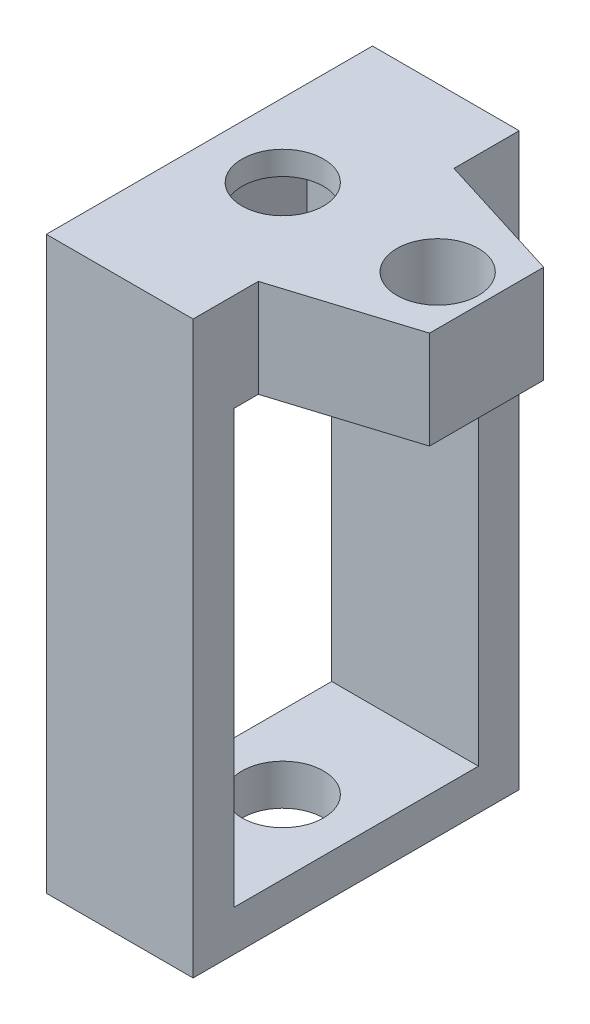
ISO-10303-21;
HEADER;
FILE_DESCRIPTION(('STEP AP214'),'2;1');
FILE_NAME('part.step','',(''),(''),'','','');
FILE_SCHEMA(('AUTOMOTIVE_DESIGN { 1 0 10303 214 1 1 1 1 }'));
ENDSEC;
DATA;
#1=APPLICATION_CONTEXT('core data for automotive mechanical design processes');
#2=APPLICATION_PROTOCOL_DEFINITION('international standard','automotive_design',2000,#1);
#3=PRODUCT_CONTEXT('',#1,'mechanical');
#4=PRODUCT('Part','Part','',(#3));
#5=PRODUCT_RELATED_PRODUCT_CATEGORY('part','',(#4));
#6=PRODUCT_DEFINITION_FORMATION('','',#4);
#7=PRODUCT_DEFINITION_CONTEXT('part definition',#1,'design');
#8=PRODUCT_DEFINITION('design','',#6,#7);
#9=PRODUCT_DEFINITION_SHAPE('','',#8);
#10=(LENGTH_UNIT() NAMED_UNIT(*) SI_UNIT(.MILLI.,.METRE.));
#11=(NAMED_UNIT(*) PLANE_ANGLE_UNIT() SI_UNIT($,.RADIAN.));
#12=(NAMED_UNIT(*) SI_UNIT($,.STERADIAN.) SOLID_ANGLE_UNIT());
#13=UNCERTAINTY_MEASURE_WITH_UNIT(LENGTH_MEASURE(1.E-05),#10,'distance_accuracy_value','');
#14=(GEOMETRIC_REPRESENTATION_CONTEXT(3) GLOBAL_UNCERTAINTY_ASSIGNED_CONTEXT((#13)) GLOBAL_UNIT_ASSIGNED_CONTEXT((#10,
#11,#12)) REPRESENTATION_CONTEXT('',''));
#15=CARTESIAN_POINT('',(0.,0.,0.));
#16=DIRECTION('',(0.,0.,1.));
#17=DIRECTION('',(1.,0.,0.));
#18=AXIS2_PLACEMENT_3D('',#15,#16,#17);
#19=CARTESIAN_POINT('',(0.,-82.,0.));
#20=DIRECTION('',(0.,1.,0.));
#21=DIRECTION('',(0.,0.,1.));
#22=AXIS2_PLACEMENT_3D('',#19,#20,#21);
#23=CYLINDRICAL_SURFACE('',#22,2.5);
#24=CARTESIAN_POINT('',(0.,-53.,0.));
#25=DIRECTION('',(0.,-1.,0.));
#26=DIRECTION('',(0.,0.,-1.));
#27=AXIS2_PLACEMENT_3D('',#24,#25,#26);
#28=CIRCLE('',#27,2.5);
#29=CARTESIAN_POINT('',(0.,-53.,-2.5));
#30=VERTEX_POINT('',#29);
#31=EDGE_CURVE('E161',#30,#30,#28,.T.);
#32=ORIENTED_EDGE('',*,*,#31,.T.);
#33=EDGE_LOOP('',(#32));
#34=FACE_BOUND('',#33,.T.);
#35=CARTESIAN_POINT('',(0.,-51.55,0.));
#36=DIRECTION('',(0.,1.,0.));
#37=DIRECTION('',(0.,0.,1.));
#38=AXIS2_PLACEMENT_3D('',#35,#36,#37);
#39=CIRCLE('',#38,2.5);
#40=CARTESIAN_POINT('',(0.,-51.55,2.5));
#41=VERTEX_POINT('',#40);
#42=EDGE_CURVE('E43',#41,#41,#39,.F.);
#43=ORIENTED_EDGE('',*,*,#42,.F.);
#44=EDGE_LOOP('',(#43));
#45=FACE_BOUND('',#44,.T.);
#46=ADVANCED_FACE('F39',(#34,#45),#23,.F.);
#47=CARTESIAN_POINT('',(-4.5,-47.,-10.));
#48=DIRECTION('',(0.,0.,1.));
#49=DIRECTION('',(1.,0.,0.));
#50=AXIS2_PLACEMENT_3D('',#47,#48,#49);
#51=PLANE('',#50);
#52=DIRECTION('',(0.,-1.,0.));
#53=VECTOR('',#52,1.);
#54=CARTESIAN_POINT('',(4.5,-47.,-10.));
#55=LINE('',#54,#53);
#56=CARTESIAN_POINT('',(4.5,-47.,-10.));
#57=VERTEX_POINT('',#56);
#58=CARTESIAN_POINT('',(4.50000000000003,-82.,-10.));
#59=VERTEX_POINT('',#58);
#60=EDGE_CURVE('E130',#57,#59,#55,.T.);
#61=ORIENTED_EDGE('',*,*,#60,.T.);
#62=DIRECTION('',(-1.,0.,0.));
#63=VECTOR('',#62,1.);
#64=CARTESIAN_POINT('',(39.7278299076171,-82.,-10.));
#65=LINE('',#64,#63);
#66=CARTESIAN_POINT('',(-4.5,-82.,-10.));
#67=VERTEX_POINT('',#66);
#68=EDGE_CURVE('E214',#59,#67,#65,.T.);
#69=ORIENTED_EDGE('',*,*,#68,.T.);
#70=DIRECTION('',(0.,-1.,0.));
#71=VECTOR('',#70,1.);
#72=CARTESIAN_POINT('',(-4.5,-47.,-10.));
#73=LINE('',#72,#71);
#74=CARTESIAN_POINT('',(-4.5,-47.,-10.));
#75=VERTEX_POINT('',#74);
#76=EDGE_CURVE('E11',#75,#67,#73,.T.);
#77=ORIENTED_EDGE('',*,*,#76,.F.);
#78=DIRECTION('',(-1.,0.,0.));
#79=VECTOR('',#78,1.);
#80=CARTESIAN_POINT('',(-4.5,-47.,-10.));
#81=LINE('',#80,#79);
#82=EDGE_CURVE('E146',#57,#75,#81,.T.);
#83=ORIENTED_EDGE('',*,*,#82,.F.);
#84=EDGE_LOOP('',(#61,#69,#77,#83));
#85=FACE_BOUND('',#84,.T.);
#86=ADVANCED_FACE('F41',(#85),#51,.F.);
#87=CARTESIAN_POINT('',(-4.5,-47.,-10.));
#88=DIRECTION('',(1.,0.,0.));
#89=DIRECTION('',(0.,0.,-1.));
#90=AXIS2_PLACEMENT_3D('',#87,#88,#89);
#91=PLANE('',#90);
#92=DIRECTION('',(0.,-1.,0.));
#93=VECTOR('',#92,1.);
#94=CARTESIAN_POINT('',(-4.5,-82.,-7.5));
#95=LINE('',#94,#93);
#96=CARTESIAN_POINT('',(-4.5,-53.,-7.5));
#97=VERTEX_POINT('',#96);
#98=CARTESIAN_POINT('',(-4.5,-79.5,-7.5));
#99=VERTEX_POINT('',#98);
#100=EDGE_CURVE('E56',#97,#99,#95,.T.);
#101=ORIENTED_EDGE('',*,*,#100,.F.);
#102=DIRECTION('',(0.,0.,1.));
#103=VECTOR('',#102,1.);
#104=CARTESIAN_POINT('',(-4.5,-53.,-10.));
#105=LINE('',#104,#103);
#106=CARTESIAN_POINT('',(-4.5,-53.,7.5));
#107=VERTEX_POINT('',#106);
#108=EDGE_CURVE('E134',#97,#107,#105,.T.);
#109=ORIENTED_EDGE('',*,*,#108,.T.);
#110=DIRECTION('',(0.,1.,0.));
#111=VECTOR('',#110,1.);
#112=CARTESIAN_POINT('',(-4.5,-53.,7.5));
#113=LINE('',#112,#111);
#114=CARTESIAN_POINT('',(-4.5,-79.5,7.49999999999999));
#115=VERTEX_POINT('',#114);
#116=EDGE_CURVE('E208',#115,#107,#113,.T.);
#117=ORIENTED_EDGE('',*,*,#116,.F.);
#118=DIRECTION('',(0.,0.,1.));
#119=VECTOR('',#118,1.);
#120=CARTESIAN_POINT('',(-4.5,-79.5,9.99999999999999));
#121=LINE('',#120,#119);
#122=EDGE_CURVE('E205',#99,#115,#121,.T.);
#123=ORIENTED_EDGE('',*,*,#122,.F.);
#124=EDGE_LOOP('',(#101,#109,#117,#123));
#125=FACE_BOUND('',#124,.T.);
#126=ORIENTED_EDGE('',*,*,#76,.T.);
#127=DIRECTION('',(0.,0.,1.));
#128=VECTOR('',#127,1.);
#129=CARTESIAN_POINT('',(-4.5,-82.,9.99999999999999));
#130=LINE('',#129,#128);
#131=CARTESIAN_POINT('',(-4.5,-82.,9.99999999999999));
#132=VERTEX_POINT('',#131);
#133=EDGE_CURVE('E211',#67,#132,#130,.T.);
#134=ORIENTED_EDGE('',*,*,#133,.T.);
#135=DIRECTION('',(0.,-1.,0.));
#136=VECTOR('',#135,1.);
#137=CARTESIAN_POINT('',(-4.5,-47.,10.));
#138=LINE('',#137,#136);
#139=CARTESIAN_POINT('',(-4.5,-47.,10.));
#140=VERTEX_POINT('',#139);
#141=EDGE_CURVE('E48',#140,#132,#138,.T.);
#142=ORIENTED_EDGE('',*,*,#141,.F.);
#143=DIRECTION('',(0.,0.,1.));
#144=VECTOR('',#143,1.);
#145=CARTESIAN_POINT('',(-4.5,-47.,-10.));
#146=LINE('',#145,#144);
#147=EDGE_CURVE('E95',#75,#140,#146,.T.);
#148=ORIENTED_EDGE('',*,*,#147,.F.);
#149=EDGE_LOOP('',(#126,#134,#142,#148));
#150=FACE_BOUND('',#149,.T.);
#151=ADVANCED_FACE('F391',(#125,#150),#91,.F.);
#152=CARTESIAN_POINT('',(-4.5,-47.,10.));
#153=DIRECTION('',(0.,0.,-1.));
#154=DIRECTION('',(-1.,0.,0.));
#155=AXIS2_PLACEMENT_3D('',#152,#153,#154);
#156=PLANE('',#155);
#157=ORIENTED_EDGE('',*,*,#141,.T.);
#158=DIRECTION('',(-1.,0.,0.));
#159=VECTOR('',#158,1.);
#160=CARTESIAN_POINT('',(39.7278299076171,-82.,9.99999999999999));
#161=LINE('',#160,#159);
#162=CARTESIAN_POINT('',(4.50000000000001,-82.,9.99999999999999));
#163=VERTEX_POINT('',#162);
#164=EDGE_CURVE('E228',#163,#132,#161,.T.);
#165=ORIENTED_EDGE('',*,*,#164,.F.);
#166=DIRECTION('',(0.,-1.,0.));
#167=VECTOR('',#166,1.);
#168=CARTESIAN_POINT('',(4.5,-47.,10.));
#169=LINE('',#168,#167);
#170=CARTESIAN_POINT('',(4.5,-47.,10.));
#171=VERTEX_POINT('',#170);
#172=EDGE_CURVE('E154',#171,#163,#169,.T.);
#173=ORIENTED_EDGE('',*,*,#172,.F.);
#174=DIRECTION('',(1.,0.,0.));
#175=VECTOR('',#174,1.);
#176=CARTESIAN_POINT('',(-4.5,-47.,10.));
#177=LINE('',#176,#175);
#178=EDGE_CURVE('E250',#140,#171,#177,.T.);
#179=ORIENTED_EDGE('',*,*,#178,.F.);
#180=EDGE_LOOP('',(#157,#165,#173,#179));
#181=FACE_BOUND('',#180,.T.);
#182=ADVANCED_FACE('F419',(#181),#156,.F.);
#183=CARTESIAN_POINT('',(4.50000000000001,-47.,6.));
#184=DIRECTION('',(-0.298274993135947,0.,-0.95447997803503));
#185=DIRECTION('',(-0.95447997803503,0.,0.298274993135947));
#186=AXIS2_PLACEMENT_3D('',#183,#184,#185);
#187=PLANE('',#186);
#188=DIRECTION('',(0.95447997803503,0.,-0.298274993135947));
#189=VECTOR('',#188,1.);
#190=CARTESIAN_POINT('',(4.50000000000001,-53.,6.));
#191=LINE('',#190,#189);
#192=CARTESIAN_POINT('',(4.50000000000001,-53.,6.));
#193=VERTEX_POINT('',#192);
#194=CARTESIAN_POINT('',(12.5,-53.,3.5));
#195=VERTEX_POINT('',#194);
#196=EDGE_CURVE('E139',#193,#195,#191,.T.);
#197=ORIENTED_EDGE('',*,*,#196,.T.);
#198=DIRECTION('',(0.,-1.,0.));
#199=VECTOR('',#198,1.);
#200=CARTESIAN_POINT('',(12.5,-47.,3.5));
#201=LINE('',#200,#199);
#202=CARTESIAN_POINT('',(12.5,-47.,3.5));
#203=VERTEX_POINT('',#202);
#204=EDGE_CURVE('E125',#203,#195,#201,.T.);
#205=ORIENTED_EDGE('',*,*,#204,.F.);
#206=DIRECTION('',(0.95447997803503,0.,-0.298274993135947));
#207=VECTOR('',#206,1.);
#208=CARTESIAN_POINT('',(4.50000000000001,-47.,6.));
#209=LINE('',#208,#207);
#210=CARTESIAN_POINT('',(4.50000000000001,-47.,6.));
#211=VERTEX_POINT('',#210);
#212=EDGE_CURVE('E116',#211,#203,#209,.T.);
#213=ORIENTED_EDGE('',*,*,#212,.F.);
#214=DIRECTION('',(0.,-1.,0.));
#215=VECTOR('',#214,1.);
#216=CARTESIAN_POINT('',(4.50000000000001,-47.,6.));
#217=LINE('',#216,#215);
#218=EDGE_CURVE('E151',#211,#193,#217,.T.);
#219=ORIENTED_EDGE('',*,*,#218,.T.);
#220=EDGE_LOOP('',(#197,#205,#213,#219));
#221=FACE_BOUND('',#220,.T.);
#222=ADVANCED_FACE('F262',(#221),#187,.F.);
#223=CARTESIAN_POINT('',(12.5,-47.,3.5));
#224=DIRECTION('',(-1.,0.,0.));
#225=DIRECTION('',(0.,0.,1.));
#226=AXIS2_PLACEMENT_3D('',#223,#224,#225);
#227=PLANE('',#226);
#228=DIRECTION('',(0.,0.,-1.));
#229=VECTOR('',#228,1.);
#230=CARTESIAN_POINT('',(12.5,-53.,3.5));
#231=LINE('',#230,#229);
#232=CARTESIAN_POINT('',(12.5,-53.,-3.5));
#233=VERTEX_POINT('',#232);
#234=EDGE_CURVE('E124',#195,#233,#231,.T.);
#235=ORIENTED_EDGE('',*,*,#234,.T.);
#236=DIRECTION('',(0.,-1.,0.));
#237=VECTOR('',#236,1.);
#238=CARTESIAN_POINT('',(12.5,-47.,-3.5));
#239=LINE('',#238,#237);
#240=CARTESIAN_POINT('',(12.5,-47.,-3.5));
#241=VERTEX_POINT('',#240);
#242=EDGE_CURVE('E121',#241,#233,#239,.T.);
#243=ORIENTED_EDGE('',*,*,#242,.F.);
#244=DIRECTION('',(0.,0.,-1.));
#245=VECTOR('',#244,1.);
#246=CARTESIAN_POINT('',(12.5,-47.,3.5));
#247=LINE('',#246,#245);
#248=EDGE_CURVE('E110',#203,#241,#247,.T.);
#249=ORIENTED_EDGE('',*,*,#248,.F.);
#250=ORIENTED_EDGE('',*,*,#204,.T.);
#251=EDGE_LOOP('',(#235,#243,#249,#250));
#252=FACE_BOUND('',#251,.T.);
#253=ADVANCED_FACE('F122',(#252),#227,.F.);
#254=CARTESIAN_POINT('',(12.5,-47.,-3.5));
#255=DIRECTION('',(-0.298274993135947,0.,0.95447997803503));
#256=DIRECTION('',(0.95447997803503,0.,0.298274993135947));
#257=AXIS2_PLACEMENT_3D('',#254,#255,#256);
#258=PLANE('',#257);
#259=DIRECTION('',(-0.95447997803503,0.,-0.298274993135947));
#260=VECTOR('',#259,1.);
#261=CARTESIAN_POINT('',(12.5,-53.,-3.5));
#262=LINE('',#261,#260);
#263=CARTESIAN_POINT('',(4.50000000000001,-53.,-6.));
#264=VERTEX_POINT('',#263);
#265=EDGE_CURVE('E87',#233,#264,#262,.T.);
#266=ORIENTED_EDGE('',*,*,#265,.T.);
#267=DIRECTION('',(0.,-1.,0.));
#268=VECTOR('',#267,1.);
#269=CARTESIAN_POINT('',(4.50000000000001,-47.,-6.));
#270=LINE('',#269,#268);
#271=CARTESIAN_POINT('',(4.50000000000001,-47.,-6.));
#272=VERTEX_POINT('',#271);
#273=EDGE_CURVE('E126',#272,#264,#270,.T.);
#274=ORIENTED_EDGE('',*,*,#273,.F.);
#275=DIRECTION('',(-0.95447997803503,0.,-0.298274993135947));
#276=VECTOR('',#275,1.);
#277=CARTESIAN_POINT('',(12.5,-47.,-3.5));
#278=LINE('',#277,#276);
#279=EDGE_CURVE('E114',#241,#272,#278,.T.);
#280=ORIENTED_EDGE('',*,*,#279,.F.);
#281=ORIENTED_EDGE('',*,*,#242,.T.);
#282=EDGE_LOOP('',(#266,#274,#280,#281));
#283=FACE_BOUND('',#282,.T.);
#284=ADVANCED_FACE('F128',(#283),#258,.F.);
#285=CARTESIAN_POINT('',(4.5,-47.,-10.));
#286=DIRECTION('',(-1.,0.,0.));
#287=DIRECTION('',(0.,0.,1.));
#288=AXIS2_PLACEMENT_3D('',#285,#286,#287);
#289=PLANE('',#288);
#290=DIRECTION('',(0.,0.,-1.));
#291=VECTOR('',#290,1.);
#292=CARTESIAN_POINT('',(4.5,-53.,-10.));
#293=LINE('',#292,#291);
#294=CARTESIAN_POINT('',(4.50000000000002,-53.,-7.5));
#295=VERTEX_POINT('',#294);
#296=EDGE_CURVE('E143',#264,#295,#293,.T.);
#297=ORIENTED_EDGE('',*,*,#296,.T.);
#298=DIRECTION('',(0.,-1.,0.));
#299=VECTOR('',#298,1.);
#300=CARTESIAN_POINT('',(4.50000000000002,-82.,-7.5));
#301=LINE('',#300,#299);
#302=CARTESIAN_POINT('',(4.50000000000002,-79.5,-7.5));
#303=VERTEX_POINT('',#302);
#304=EDGE_CURVE('E222',#295,#303,#301,.T.);
#305=ORIENTED_EDGE('',*,*,#304,.T.);
#306=DIRECTION('',(0.,0.,1.));
#307=VECTOR('',#306,1.);
#308=CARTESIAN_POINT('',(4.5,-79.5,9.99999999999996));
#309=LINE('',#308,#307);
#310=CARTESIAN_POINT('',(4.5,-79.5,7.49999999999999));
#311=VERTEX_POINT('',#310);
#312=EDGE_CURVE('E218',#303,#311,#309,.T.);
#313=ORIENTED_EDGE('',*,*,#312,.T.);
#314=DIRECTION('',(0.,1.,0.));
#315=VECTOR('',#314,1.);
#316=CARTESIAN_POINT('',(4.5,-53.,7.5));
#317=LINE('',#316,#315);
#318=CARTESIAN_POINT('',(4.50000000000001,-53.,7.5));
#319=VERTEX_POINT('',#318);
#320=EDGE_CURVE('E215',#311,#319,#317,.T.);
#321=ORIENTED_EDGE('',*,*,#320,.T.);
#322=DIRECTION('',(0.,0.,-1.));
#323=VECTOR('',#322,1.);
#324=CARTESIAN_POINT('',(4.5,-53.,10.));
#325=LINE('',#324,#323);
#326=EDGE_CURVE('E136',#319,#193,#325,.T.);
#327=ORIENTED_EDGE('',*,*,#326,.T.);
#328=ORIENTED_EDGE('',*,*,#218,.F.);
#329=DIRECTION('',(0.,0.,-1.));
#330=VECTOR('',#329,1.);
#331=CARTESIAN_POINT('',(4.5,-47.,10.));
#332=LINE('',#331,#330);
#333=EDGE_CURVE('E252',#171,#211,#332,.T.);
#334=ORIENTED_EDGE('',*,*,#333,.F.);
#335=ORIENTED_EDGE('',*,*,#172,.T.);
#336=DIRECTION('',(0.,0.,1.));
#337=VECTOR('',#336,1.);
#338=CARTESIAN_POINT('',(4.5,-82.,9.99999999999996));
#339=LINE('',#338,#337);
#340=EDGE_CURVE('E219',#59,#163,#339,.T.);
#341=ORIENTED_EDGE('',*,*,#340,.F.);
#342=ORIENTED_EDGE('',*,*,#60,.F.);
#343=DIRECTION('',(0.,0.,-1.));
#344=VECTOR('',#343,1.);
#345=CARTESIAN_POINT('',(4.5,-47.,-10.));
#346=LINE('',#345,#344);
#347=EDGE_CURVE('E65',#272,#57,#346,.T.);
#348=ORIENTED_EDGE('',*,*,#347,.F.);
#349=ORIENTED_EDGE('',*,*,#273,.T.);
#350=EDGE_LOOP('',(#297,#305,#313,#321,#327,#328,#334,#335,#341,#342,#348,#349));
#351=FACE_BOUND('',#350,.T.);
#352=ADVANCED_FACE('F258',(#351),#289,.F.);
#353=CARTESIAN_POINT('',(0.,-47.,0.));
#354=DIRECTION('',(0.,-1.,0.));
#355=DIRECTION('',(0.,0.,-1.));
#356=AXIS2_PLACEMENT_3D('',#353,#354,#355);
#357=PLANE('',#356);
#358=CARTESIAN_POINT('',(0.,-47.,0.));
#359=DIRECTION('',(0.,1.,0.));
#360=DIRECTION('',(0.,0.,1.));
#361=AXIS2_PLACEMENT_3D('',#358,#359,#360);
#362=CIRCLE('',#361,2.5);
#363=CARTESIAN_POINT('',(0.,-47.,2.5));
#364=VERTEX_POINT('',#363);
#365=EDGE_CURVE('E169',#364,#364,#362,.T.);
#366=ORIENTED_EDGE('',*,*,#365,.F.);
#367=EDGE_LOOP('',(#366));
#368=FACE_BOUND('',#367,.T.);
#369=CARTESIAN_POINT('',(9.5,-47.,0.));
#370=DIRECTION('',(0.,1.,0.));
#371=DIRECTION('',(0.,0.,1.));
#372=AXIS2_PLACEMENT_3D('',#369,#370,#371);
#373=CIRCLE('',#372,2.5);
#374=CARTESIAN_POINT('',(9.5,-47.,2.5));
#375=VERTEX_POINT('',#374);
#376=EDGE_CURVE('E225',#375,#375,#373,.T.);
#377=ORIENTED_EDGE('',*,*,#376,.F.);
#378=EDGE_LOOP('',(#377));
#379=FACE_BOUND('',#378,.T.);
#380=ORIENTED_EDGE('',*,*,#82,.T.);
#381=ORIENTED_EDGE('',*,*,#147,.T.);
#382=ORIENTED_EDGE('',*,*,#178,.T.);
#383=ORIENTED_EDGE('',*,*,#333,.T.);
#384=ORIENTED_EDGE('',*,*,#212,.T.);
#385=ORIENTED_EDGE('',*,*,#248,.T.);
#386=ORIENTED_EDGE('',*,*,#279,.T.);
#387=ORIENTED_EDGE('',*,*,#347,.T.);
#388=EDGE_LOOP('',(#380,#381,#382,#383,#384,#385,#386,#387));
#389=FACE_BOUND('',#388,.T.);
#390=ADVANCED_FACE('F112',(#368,#379,#389),#357,.F.);
#391=CARTESIAN_POINT('',(0.,-53.,0.));
#392=DIRECTION('',(0.,-1.,0.));
#393=DIRECTION('',(0.,0.,-1.));
#394=AXIS2_PLACEMENT_3D('',#391,#392,#393);
#395=PLANE('',#394);
#396=ORIENTED_EDGE('',*,*,#31,.F.);
#397=EDGE_LOOP('',(#396));
#398=FACE_BOUND('',#397,.T.);
#399=DIRECTION('',(-1.,0.,0.));
#400=VECTOR('',#399,1.);
#401=CARTESIAN_POINT('',(39.7278299076171,-53.,7.5));
#402=LINE('',#401,#400);
#403=EDGE_CURVE('E231',#319,#107,#402,.T.);
#404=ORIENTED_EDGE('',*,*,#403,.T.);
#405=ORIENTED_EDGE('',*,*,#108,.F.);
#406=DIRECTION('',(-1.,0.,0.));
#407=VECTOR('',#406,1.);
#408=CARTESIAN_POINT('',(39.7278299076171,-53.,-7.5));
#409=LINE('',#408,#407);
#410=EDGE_CURVE('E240',#295,#97,#409,.T.);
#411=ORIENTED_EDGE('',*,*,#410,.F.);
#412=ORIENTED_EDGE('',*,*,#296,.F.);
#413=ORIENTED_EDGE('',*,*,#265,.F.);
#414=ORIENTED_EDGE('',*,*,#234,.F.);
#415=ORIENTED_EDGE('',*,*,#196,.F.);
#416=ORIENTED_EDGE('',*,*,#326,.F.);
#417=EDGE_LOOP('',(#404,#405,#411,#412,#413,#414,#415,#416));
#418=FACE_BOUND('',#417,.T.);
#419=CARTESIAN_POINT('',(9.5,-53.,0.));
#420=DIRECTION('',(0.,1.,0.));
#421=DIRECTION('',(0.,0.,1.));
#422=AXIS2_PLACEMENT_3D('',#419,#420,#421);
#423=CIRCLE('',#422,2.5);
#424=CARTESIAN_POINT('',(9.5,-53.,2.5));
#425=VERTEX_POINT('',#424);
#426=EDGE_CURVE('E137',#425,#425,#423,.T.);
#427=ORIENTED_EDGE('',*,*,#426,.T.);
#428=EDGE_LOOP('',(#427));
#429=FACE_BOUND('',#428,.T.);
#430=ADVANCED_FACE('F264',(#398,#418,#429),#395,.T.);
#431=CARTESIAN_POINT('',(9.5,-53.,0.));
#432=DIRECTION('',(0.,1.,0.));
#433=DIRECTION('',(0.,0.,1.));
#434=AXIS2_PLACEMENT_3D('',#431,#432,#433);
#435=CYLINDRICAL_SURFACE('',#434,2.5);
#436=ORIENTED_EDGE('',*,*,#426,.F.);
#437=EDGE_LOOP('',(#436));
#438=FACE_BOUND('',#437,.T.);
#439=ORIENTED_EDGE('',*,*,#376,.T.);
#440=EDGE_LOOP('',(#439));
#441=FACE_BOUND('',#440,.T.);
#442=ADVANCED_FACE('F411',(#438,#441),#435,.F.);
#443=CARTESIAN_POINT('',(39.7278299076171,-82.,9.99999999999999));
#444=DIRECTION('',(0.,1.,0.));
#445=DIRECTION('',(0.,0.,1.));
#446=AXIS2_PLACEMENT_3D('',#443,#444,#445);
#447=PLANE('',#446);
#448=CARTESIAN_POINT('',(0.,-82.,0.));
#449=DIRECTION('',(0.,1.,0.));
#450=DIRECTION('',(0.,0.,1.));
#451=AXIS2_PLACEMENT_3D('',#448,#449,#450);
#452=CIRCLE('',#451,2.5);
#453=CARTESIAN_POINT('',(0.,-82.,2.5));
#454=VERTEX_POINT('',#453);
#455=EDGE_CURVE('E162',#454,#454,#452,.T.);
#456=ORIENTED_EDGE('',*,*,#455,.T.);
#457=EDGE_LOOP('',(#456));
#458=FACE_BOUND('',#457,.T.);
#459=ORIENTED_EDGE('',*,*,#68,.F.);
#460=ORIENTED_EDGE('',*,*,#340,.T.);
#461=ORIENTED_EDGE('',*,*,#164,.T.);
#462=ORIENTED_EDGE('',*,*,#133,.F.);
#463=EDGE_LOOP('',(#459,#460,#461,#462));
#464=FACE_BOUND('',#463,.T.);
#465=ADVANCED_FACE('F407',(#458,#464),#447,.F.);
#466=CARTESIAN_POINT('',(39.7278299076171,-53.,7.5));
#467=DIRECTION('',(0.,0.,-1.));
#468=DIRECTION('',(0.,1.,0.));
#469=AXIS2_PLACEMENT_3D('',#466,#467,#468);
#470=PLANE('',#469);
#471=ORIENTED_EDGE('',*,*,#320,.F.);
#472=DIRECTION('',(-1.,0.,0.));
#473=VECTOR('',#472,1.);
#474=CARTESIAN_POINT('',(39.7278299076171,-79.5,7.49999999999999));
#475=LINE('',#474,#473);
#476=EDGE_CURVE('E234',#311,#115,#475,.T.);
#477=ORIENTED_EDGE('',*,*,#476,.T.);
#478=ORIENTED_EDGE('',*,*,#116,.T.);
#479=ORIENTED_EDGE('',*,*,#403,.F.);
#480=EDGE_LOOP('',(#471,#477,#478,#479));
#481=FACE_BOUND('',#480,.T.);
#482=ADVANCED_FACE('F410',(#481),#470,.T.);
#483=CARTESIAN_POINT('',(39.7278299076171,-79.5,9.99999999999999));
#484=DIRECTION('',(0.,1.,0.));
#485=DIRECTION('',(0.,0.,1.));
#486=AXIS2_PLACEMENT_3D('',#483,#484,#485);
#487=PLANE('',#486);
#488=CARTESIAN_POINT('',(0.,-79.5,0.));
#489=DIRECTION('',(0.,1.,0.));
#490=DIRECTION('',(0.,0.,1.));
#491=AXIS2_PLACEMENT_3D('',#488,#489,#490);
#492=CIRCLE('',#491,2.5);
#493=CARTESIAN_POINT('',(0.,-79.5,2.5));
#494=VERTEX_POINT('',#493);
#495=EDGE_CURVE('E159',#494,#494,#492,.T.);
#496=ORIENTED_EDGE('',*,*,#495,.F.);
#497=EDGE_LOOP('',(#496));
#498=FACE_BOUND('',#497,.T.);
#499=ORIENTED_EDGE('',*,*,#312,.F.);
#500=DIRECTION('',(-1.,0.,0.));
#501=VECTOR('',#500,1.);
#502=CARTESIAN_POINT('',(39.7278299076171,-79.5,-7.5));
#503=LINE('',#502,#501);
#504=EDGE_CURVE('E237',#303,#99,#503,.T.);
#505=ORIENTED_EDGE('',*,*,#504,.T.);
#506=ORIENTED_EDGE('',*,*,#122,.T.);
#507=ORIENTED_EDGE('',*,*,#476,.F.);
#508=EDGE_LOOP('',(#499,#505,#506,#507));
#509=FACE_BOUND('',#508,.T.);
#510=ADVANCED_FACE('F401',(#498,#509),#487,.T.);
#511=CARTESIAN_POINT('',(39.7278299076171,-82.,-7.5));
#512=DIRECTION('',(0.,0.,1.));
#513=DIRECTION('',(1.,0.,0.));
#514=AXIS2_PLACEMENT_3D('',#511,#512,#513);
#515=PLANE('',#514);
#516=ORIENTED_EDGE('',*,*,#304,.F.);
#517=ORIENTED_EDGE('',*,*,#410,.T.);
#518=ORIENTED_EDGE('',*,*,#100,.T.);
#519=ORIENTED_EDGE('',*,*,#504,.F.);
#520=EDGE_LOOP('',(#516,#517,#518,#519));
#521=FACE_BOUND('',#520,.T.);
#522=ADVANCED_FACE('F395',(#521),#515,.T.);
#523=ORIENTED_EDGE('',*,*,#495,.T.);
#524=EDGE_LOOP('',(#523));
#525=FACE_BOUND('',#524,.T.);
#526=ORIENTED_EDGE('',*,*,#455,.F.);
#527=EDGE_LOOP('',(#526));
#528=FACE_BOUND('',#527,.T.);
#529=ADVANCED_FACE('F385',(#525,#528),#23,.F.);
#530=CARTESIAN_POINT('',(0.,-48.45,0.));
#531=DIRECTION('',(0.,1.,0.));
#532=DIRECTION('',(0.,0.,1.));
#533=AXIS2_PLACEMENT_3D('',#530,#531,#532);
#534=CIRCLE('',#533,2.5);
#535=CARTESIAN_POINT('',(0.,-48.45,2.5));
#536=VERTEX_POINT('',#535);
#537=EDGE_CURVE('E163',#536,#536,#534,.F.);
#538=ORIENTED_EDGE('',*,*,#537,.T.);
#539=EDGE_LOOP('',(#538));
#540=FACE_BOUND('',#539,.T.);
#541=ORIENTED_EDGE('',*,*,#365,.T.);
#542=EDGE_LOOP('',(#541));
#543=FACE_BOUND('',#542,.T.);
#544=ADVANCED_FACE('F384',(#540,#543),#23,.F.);
#545=CARTESIAN_POINT('',(0.,-51.55,0.));
#546=DIRECTION('',(0.,1.,0.));
#547=DIRECTION('',(0.,0.,1.));
#548=AXIS2_PLACEMENT_3D('',#545,#546,#547);
#549=PLANE('',#548);
#550=DIRECTION('',(1.,0.,0.));
#551=VECTOR('',#550,1.);
#552=CARTESIAN_POINT('',(-2.02072594216369,-51.55,3.5));
#553=LINE('',#552,#551);
#554=CARTESIAN_POINT('',(-2.02072594216369,-51.55,3.5));
#555=VERTEX_POINT('',#554);
#556=CARTESIAN_POINT('',(2.02072594216369,-51.55,3.5));
#557=VERTEX_POINT('',#556);
#558=EDGE_CURVE('E322',#555,#557,#553,.T.);
#559=ORIENTED_EDGE('',*,*,#558,.T.);
#560=DIRECTION('',(0.5,0.,-0.866025403784439));
#561=VECTOR('',#560,1.);
#562=CARTESIAN_POINT('',(2.02072594216369,-51.55,3.5));
#563=LINE('',#562,#561);
#564=CARTESIAN_POINT('',(4.04145188432738,-51.55,0.));
#565=VERTEX_POINT('',#564);
#566=EDGE_CURVE('E329',#557,#565,#563,.T.);
#567=ORIENTED_EDGE('',*,*,#566,.T.);
#568=DIRECTION('',(-0.5,0.,-0.866025403784439));
#569=VECTOR('',#568,1.);
#570=CARTESIAN_POINT('',(4.04145188432738,-51.55,0.));
#571=LINE('',#570,#569);
#572=CARTESIAN_POINT('',(2.02072594216369,-51.55,-3.5));
#573=VERTEX_POINT('',#572);
#574=EDGE_CURVE('E334',#565,#573,#571,.T.);
#575=ORIENTED_EDGE('',*,*,#574,.T.);
#576=DIRECTION('',(-1.,0.,0.));
#577=VECTOR('',#576,1.);
#578=CARTESIAN_POINT('',(2.02072594216369,-51.55,-3.5));
#579=LINE('',#578,#577);
#580=CARTESIAN_POINT('',(-2.02072594216369,-51.55,-3.5));
#581=VERTEX_POINT('',#580);
#582=EDGE_CURVE('E345',#573,#581,#579,.T.);
#583=ORIENTED_EDGE('',*,*,#582,.T.);
#584=DIRECTION('',(-0.5,0.,0.866025403784439));
#585=VECTOR('',#584,1.);
#586=CARTESIAN_POINT('',(-2.02072594216369,-51.55,-3.5));
#587=LINE('',#586,#585);
#588=CARTESIAN_POINT('',(-4.04145188432738,-51.55,0.));
#589=VERTEX_POINT('',#588);
#590=EDGE_CURVE('E348',#581,#589,#587,.T.);
#591=ORIENTED_EDGE('',*,*,#590,.T.);
#592=DIRECTION('',(0.5,0.,0.866025403784439));
#593=VECTOR('',#592,1.);
#594=CARTESIAN_POINT('',(-4.04145188432738,-51.55,0.));
#595=LINE('',#594,#593);
#596=EDGE_CURVE('E197',#589,#555,#595,.T.);
#597=ORIENTED_EDGE('',*,*,#596,.T.);
#598=EDGE_LOOP('',(#559,#567,#575,#583,#591,#597));
#599=FACE_BOUND('',#598,.T.);
#600=ORIENTED_EDGE('',*,*,#42,.T.);
#601=EDGE_LOOP('',(#600));
#602=FACE_BOUND('',#601,.T.);
#603=ADVANCED_FACE('F336',(#599,#602),#549,.T.);
#604=CARTESIAN_POINT('',(0.,-48.45,0.));
#605=DIRECTION('',(0.,1.,0.));
#606=DIRECTION('',(0.,0.,1.));
#607=AXIS2_PLACEMENT_3D('',#604,#605,#606);
#608=PLANE('',#607);
#609=DIRECTION('',(1.,0.,0.));
#610=VECTOR('',#609,1.);
#611=CARTESIAN_POINT('',(-2.02072594216369,-48.45,3.5));
#612=LINE('',#611,#610);
#613=CARTESIAN_POINT('',(-2.02072594216369,-48.45,3.5));
#614=VERTEX_POINT('',#613);
#615=CARTESIAN_POINT('',(2.02072594216369,-48.45,3.5));
#616=VERTEX_POINT('',#615);
#617=EDGE_CURVE('E324',#614,#616,#612,.T.);
#618=ORIENTED_EDGE('',*,*,#617,.F.);
#619=DIRECTION('',(0.5,0.,0.866025403784439));
#620=VECTOR('',#619,1.);
#621=CARTESIAN_POINT('',(-4.04145188432738,-48.45,0.));
#622=LINE('',#621,#620);
#623=CARTESIAN_POINT('',(-4.04145188432738,-48.45,0.));
#624=VERTEX_POINT('',#623);
#625=EDGE_CURVE('E183',#624,#614,#622,.T.);
#626=ORIENTED_EDGE('',*,*,#625,.F.);
#627=DIRECTION('',(-0.5,0.,0.866025403784439));
#628=VECTOR('',#627,1.);
#629=CARTESIAN_POINT('',(-2.02072594216369,-48.45,-3.5));
#630=LINE('',#629,#628);
#631=CARTESIAN_POINT('',(-2.02072594216369,-48.45,-3.5));
#632=VERTEX_POINT('',#631);
#633=EDGE_CURVE('E342',#632,#624,#630,.T.);
#634=ORIENTED_EDGE('',*,*,#633,.F.);
#635=DIRECTION('',(-1.,0.,0.));
#636=VECTOR('',#635,1.);
#637=CARTESIAN_POINT('',(2.02072594216369,-48.45,-3.5));
#638=LINE('',#637,#636);
#639=CARTESIAN_POINT('',(2.02072594216369,-48.45,-3.5));
#640=VERTEX_POINT('',#639);
#641=EDGE_CURVE('E357',#640,#632,#638,.T.);
#642=ORIENTED_EDGE('',*,*,#641,.F.);
#643=DIRECTION('',(-0.5,0.,-0.866025403784439));
#644=VECTOR('',#643,1.);
#645=CARTESIAN_POINT('',(4.04145188432738,-48.45,0.));
#646=LINE('',#645,#644);
#647=CARTESIAN_POINT('',(4.04145188432738,-48.45,0.));
#648=VERTEX_POINT('',#647);
#649=EDGE_CURVE('E354',#648,#640,#646,.T.);
#650=ORIENTED_EDGE('',*,*,#649,.F.);
#651=DIRECTION('',(0.5,0.,-0.866025403784439));
#652=VECTOR('',#651,1.);
#653=CARTESIAN_POINT('',(2.02072594216369,-48.45,3.5));
#654=LINE('',#653,#652);
#655=EDGE_CURVE('E352',#616,#648,#654,.T.);
#656=ORIENTED_EDGE('',*,*,#655,.F.);
#657=EDGE_LOOP('',(#618,#626,#634,#642,#650,#656));
#658=FACE_BOUND('',#657,.T.);
#659=ORIENTED_EDGE('',*,*,#537,.F.);
#660=EDGE_LOOP('',(#659));
#661=FACE_BOUND('',#660,.T.);
#662=ADVANCED_FACE('F367',(#658,#661),#608,.F.);
#663=CARTESIAN_POINT('',(-2.02072594216369,-51.55,3.5));
#664=DIRECTION('',(0.,0.,1.));
#665=DIRECTION('',(1.,0.,0.));
#666=AXIS2_PLACEMENT_3D('',#663,#664,#665);
#667=PLANE('',#666);
#668=ORIENTED_EDGE('',*,*,#617,.T.);
#669=DIRECTION('',(0.,1.,0.));
#670=VECTOR('',#669,1.);
#671=CARTESIAN_POINT('',(2.02072594216369,-51.55,3.5));
#672=LINE('',#671,#670);
#673=EDGE_CURVE('E194',#557,#616,#672,.T.);
#674=ORIENTED_EDGE('',*,*,#673,.F.);
#675=ORIENTED_EDGE('',*,*,#558,.F.);
#676=DIRECTION('',(0.,1.,0.));
#677=VECTOR('',#676,1.);
#678=CARTESIAN_POINT('',(-2.02072594216369,-51.55,3.5));
#679=LINE('',#678,#677);
#680=EDGE_CURVE('E165',#555,#614,#679,.T.);
#681=ORIENTED_EDGE('',*,*,#680,.T.);
#682=EDGE_LOOP('',(#668,#674,#675,#681));
#683=FACE_BOUND('',#682,.T.);
#684=ADVANCED_FACE('F320',(#683),#667,.F.);
#685=CARTESIAN_POINT('',(-4.04145188432738,-51.55,0.));
#686=DIRECTION('',(-0.866025403784439,0.,0.5));
#687=DIRECTION('',(0.5,0.,0.866025403784438));
#688=AXIS2_PLACEMENT_3D('',#685,#686,#687);
#689=PLANE('',#688);
#690=ORIENTED_EDGE('',*,*,#625,.T.);
#691=ORIENTED_EDGE('',*,*,#680,.F.);
#692=ORIENTED_EDGE('',*,*,#596,.F.);
#693=DIRECTION('',(0.,1.,0.));
#694=VECTOR('',#693,1.);
#695=CARTESIAN_POINT('',(-4.04145188432738,-51.55,0.));
#696=LINE('',#695,#694);
#697=EDGE_CURVE('E171',#589,#624,#696,.T.);
#698=ORIENTED_EDGE('',*,*,#697,.T.);
#699=EDGE_LOOP('',(#690,#691,#692,#698));
#700=FACE_BOUND('',#699,.T.);
#701=ADVANCED_FACE('F370',(#700),#689,.F.);
#702=CARTESIAN_POINT('',(-2.02072594216369,-51.55,-3.5));
#703=DIRECTION('',(-0.866025403784438,0.,-0.5));
#704=DIRECTION('',(-0.5,0.,0.866025403784439));
#705=AXIS2_PLACEMENT_3D('',#702,#703,#704);
#706=PLANE('',#705);
#707=ORIENTED_EDGE('',*,*,#633,.T.);
#708=ORIENTED_EDGE('',*,*,#697,.F.);
#709=ORIENTED_EDGE('',*,*,#590,.F.);
#710=DIRECTION('',(0.,1.,0.));
#711=VECTOR('',#710,1.);
#712=CARTESIAN_POINT('',(-2.02072594216369,-51.55,-3.5));
#713=LINE('',#712,#711);
#714=EDGE_CURVE('E180',#581,#632,#713,.T.);
#715=ORIENTED_EDGE('',*,*,#714,.T.);
#716=EDGE_LOOP('',(#707,#708,#709,#715));
#717=FACE_BOUND('',#716,.T.);
#718=ADVANCED_FACE('F363',(#717),#706,.F.);
#719=CARTESIAN_POINT('',(2.02072594216369,-51.55,-3.5));
#720=DIRECTION('',(0.,0.,-1.));
#721=DIRECTION('',(-1.,0.,0.));
#722=AXIS2_PLACEMENT_3D('',#719,#720,#721);
#723=PLANE('',#722);
#724=ORIENTED_EDGE('',*,*,#641,.T.);
#725=ORIENTED_EDGE('',*,*,#714,.F.);
#726=ORIENTED_EDGE('',*,*,#582,.F.);
#727=DIRECTION('',(0.,1.,0.));
#728=VECTOR('',#727,1.);
#729=CARTESIAN_POINT('',(2.02072594216369,-51.55,-3.5));
#730=LINE('',#729,#728);
#731=EDGE_CURVE('E188',#573,#640,#730,.T.);
#732=ORIENTED_EDGE('',*,*,#731,.T.);
#733=EDGE_LOOP('',(#724,#725,#726,#732));
#734=FACE_BOUND('',#733,.T.);
#735=ADVANCED_FACE('F377',(#734),#723,.F.);
#736=CARTESIAN_POINT('',(4.04145188432738,-51.55,0.));
#737=DIRECTION('',(0.866025403784438,0.,-0.5));
#738=DIRECTION('',(-0.5,0.,-0.866025403784439));
#739=AXIS2_PLACEMENT_3D('',#736,#737,#738);
#740=PLANE('',#739);
#741=ORIENTED_EDGE('',*,*,#649,.T.);
#742=ORIENTED_EDGE('',*,*,#731,.F.);
#743=ORIENTED_EDGE('',*,*,#574,.F.);
#744=DIRECTION('',(0.,1.,0.));
#745=VECTOR('',#744,1.);
#746=CARTESIAN_POINT('',(4.04145188432738,-51.55,0.));
#747=LINE('',#746,#745);
#748=EDGE_CURVE('E191',#565,#648,#747,.T.);
#749=ORIENTED_EDGE('',*,*,#748,.T.);
#750=EDGE_LOOP('',(#741,#742,#743,#749));
#751=FACE_BOUND('',#750,.T.);
#752=ADVANCED_FACE('F535',(#751),#740,.F.);
#753=CARTESIAN_POINT('',(2.02072594216369,-51.55,3.5));
#754=DIRECTION('',(0.866025403784439,0.,0.5));
#755=DIRECTION('',(0.5,0.,-0.866025403784439));
#756=AXIS2_PLACEMENT_3D('',#753,#754,#755);
#757=PLANE('',#756);
#758=ORIENTED_EDGE('',*,*,#655,.T.);
#759=ORIENTED_EDGE('',*,*,#748,.F.);
#760=ORIENTED_EDGE('',*,*,#566,.F.);
#761=ORIENTED_EDGE('',*,*,#673,.T.);
#762=EDGE_LOOP('',(#758,#759,#760,#761));
#763=FACE_BOUND('',#762,.T.);
#764=ADVANCED_FACE('F330',(#763),#757,.F.);
#765=CLOSED_SHELL('',(#46,#86,#151,#182,#222,#253,#284,#352,#390,#430,#442,#465,#482,#510,#522,
#529,#544,#603,#662,#684,#701,#718,#735,#752,#764));
#766=MANIFOLD_SOLID_BREP('B2',#765);
#767=ADVANCED_BREP_SHAPE_REPRESENTATION('',(#18,#766),#14);
#768=SHAPE_DEFINITION_REPRESENTATION(#9,#767);
ENDSEC;
END-ISO-10303-21;
